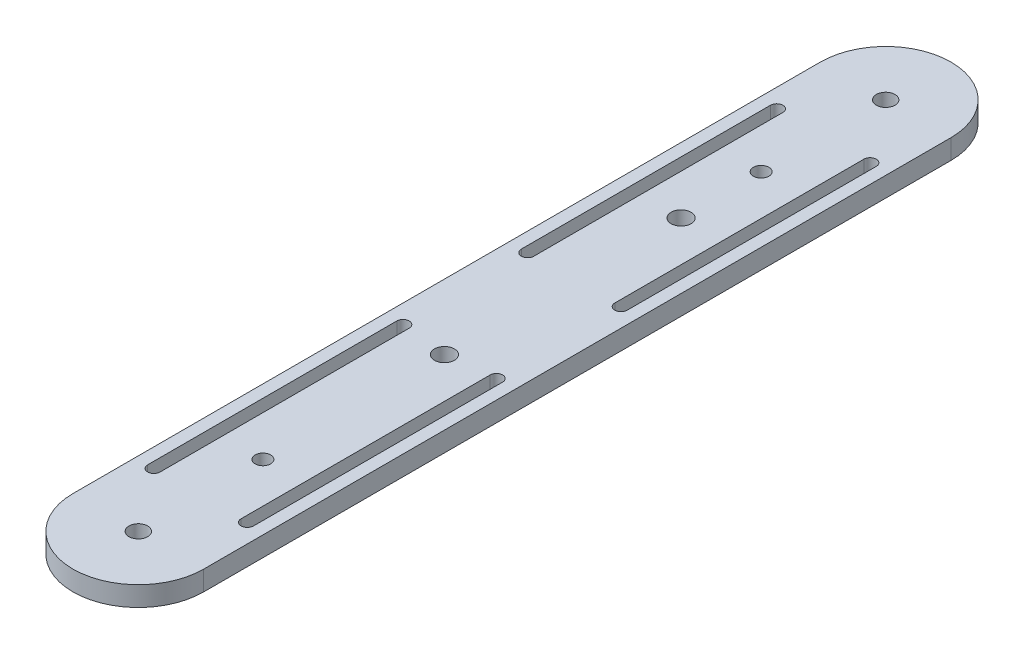
ISO-10303-21;
HEADER;
FILE_DESCRIPTION(('STEP AP214'),'2;1');
FILE_NAME('part.step','',(''),(''),'','','');
FILE_SCHEMA(('AUTOMOTIVE_DESIGN { 1 0 10303 214 1 1 1 1 }'));
ENDSEC;
DATA;
#1=APPLICATION_CONTEXT('core data for automotive mechanical design processes');
#2=APPLICATION_PROTOCOL_DEFINITION('international standard','automotive_design',2000,#1);
#3=PRODUCT_CONTEXT('',#1,'mechanical');
#4=PRODUCT('Part','Part','',(#3));
#5=PRODUCT_RELATED_PRODUCT_CATEGORY('part','',(#4));
#6=PRODUCT_DEFINITION_FORMATION('','',#4);
#7=PRODUCT_DEFINITION_CONTEXT('part definition',#1,'design');
#8=PRODUCT_DEFINITION('design','',#6,#7);
#9=PRODUCT_DEFINITION_SHAPE('','',#8);
#10=(LENGTH_UNIT() NAMED_UNIT(*) SI_UNIT(.MILLI.,.METRE.));
#11=(NAMED_UNIT(*) PLANE_ANGLE_UNIT() SI_UNIT($,.RADIAN.));
#12=(NAMED_UNIT(*) SI_UNIT($,.STERADIAN.) SOLID_ANGLE_UNIT());
#13=UNCERTAINTY_MEASURE_WITH_UNIT(LENGTH_MEASURE(1.E-05),#10,'distance_accuracy_value','');
#14=(GEOMETRIC_REPRESENTATION_CONTEXT(3) GLOBAL_UNCERTAINTY_ASSIGNED_CONTEXT((#13)) GLOBAL_UNIT_ASSIGNED_CONTEXT((#10,
#11,#12)) REPRESENTATION_CONTEXT('',''));
#15=CARTESIAN_POINT('',(0.,0.,0.));
#16=DIRECTION('',(0.,0.,1.));
#17=DIRECTION('',(1.,0.,0.));
#18=AXIS2_PLACEMENT_3D('',#15,#16,#17);
#19=CARTESIAN_POINT('',(0.,3.175,0.));
#20=DIRECTION('',(0.,1.,0.));
#21=DIRECTION('',(0.,0.,1.));
#22=AXIS2_PLACEMENT_3D('',#19,#20,#21);
#23=PLANE('',#22);
#24=CARTESIAN_POINT('',(0.,3.175,70.85));
#25=DIRECTION('',(0.,1.,0.));
#26=DIRECTION('',(0.,0.,1.));
#27=AXIS2_PLACEMENT_3D('',#24,#25,#26);
#28=CIRCLE('',#27,1.6);
#29=CARTESIAN_POINT('',(0.,3.175,72.45));
#30=VERTEX_POINT('',#29);
#31=EDGE_CURVE('E229',#30,#30,#28,.T.);
#32=ORIENTED_EDGE('',*,*,#31,.F.);
#33=EDGE_LOOP('',(#32));
#34=FACE_BOUND('',#33,.T.);
#35=CARTESIAN_POINT('',(0.,3.175,32.85));
#36=DIRECTION('',(0.,1.,0.));
#37=DIRECTION('',(0.,0.,1.));
#38=AXIS2_PLACEMENT_3D('',#35,#36,#37);
#39=CIRCLE('',#38,1.6);
#40=CARTESIAN_POINT('',(0.,3.175,34.45));
#41=VERTEX_POINT('',#40);
#42=EDGE_CURVE('E482',#41,#41,#39,.T.);
#43=ORIENTED_EDGE('',*,*,#42,.F.);
#44=EDGE_LOOP('',(#43));
#45=FACE_BOUND('',#44,.T.);
#46=CARTESIAN_POINT('',(-7.50000000000002,3.175,70.));
#47=DIRECTION('',(0.,1.,0.));
#48=DIRECTION('',(0.,0.,1.));
#49=AXIS2_PLACEMENT_3D('',#46,#47,#48);
#50=CIRCLE('',#49,0.999999999999999);
#51=CARTESIAN_POINT('',(-6.5,3.175,70.));
#52=VERTEX_POINT('',#51);
#53=CARTESIAN_POINT('',(-8.5,3.175,70.));
#54=VERTEX_POINT('',#53);
#55=EDGE_CURVE('E293',#52,#54,#50,.T.);
#56=ORIENTED_EDGE('',*,*,#55,.F.);
#57=DIRECTION('',(0.,0.,-1.));
#58=VECTOR('',#57,1.);
#59=CARTESIAN_POINT('',(-6.5,3.175,0.));
#60=LINE('',#59,#58);
#61=CARTESIAN_POINT('',(-6.5,3.175,110.));
#62=VERTEX_POINT('',#61);
#63=EDGE_CURVE('E287',#62,#52,#60,.T.);
#64=ORIENTED_EDGE('',*,*,#63,.F.);
#65=CARTESIAN_POINT('',(-7.50000000000013,3.175,110.));
#66=DIRECTION('',(0.,1.,0.));
#67=DIRECTION('',(0.,0.,1.));
#68=AXIS2_PLACEMENT_3D('',#65,#66,#67);
#69=CIRCLE('',#68,0.999999999999999);
#70=CARTESIAN_POINT('',(-8.50000000000013,3.175,110.));
#71=VERTEX_POINT('',#70);
#72=EDGE_CURVE('E289',#71,#62,#69,.T.);
#73=ORIENTED_EDGE('',*,*,#72,.F.);
#74=DIRECTION('',(0.,0.,1.));
#75=VECTOR('',#74,1.);
#76=CARTESIAN_POINT('',(-8.5,3.175,0.));
#77=LINE('',#76,#75);
#78=EDGE_CURVE('E291',#54,#71,#77,.T.);
#79=ORIENTED_EDGE('',*,*,#78,.F.);
#80=EDGE_LOOP('',(#56,#64,#73,#79));
#81=FACE_BOUND('',#80,.T.);
#82=CARTESIAN_POINT('',(7.49999999999986,3.175,110.));
#83=DIRECTION('',(0.,1.,0.));
#84=DIRECTION('',(0.,0.,1.));
#85=AXIS2_PLACEMENT_3D('',#82,#83,#84);
#86=CIRCLE('',#85,0.999999999999999);
#87=CARTESIAN_POINT('',(6.5,3.175,110.));
#88=VERTEX_POINT('',#87);
#89=CARTESIAN_POINT('',(8.5,3.175,110.));
#90=VERTEX_POINT('',#89);
#91=EDGE_CURVE('E285',#88,#90,#86,.T.);
#92=ORIENTED_EDGE('',*,*,#91,.F.);
#93=DIRECTION('',(0.,0.,1.));
#94=VECTOR('',#93,1.);
#95=CARTESIAN_POINT('',(6.5,3.175,0.));
#96=LINE('',#95,#94);
#97=CARTESIAN_POINT('',(6.5,3.175,70.));
#98=VERTEX_POINT('',#97);
#99=EDGE_CURVE('E279',#98,#88,#96,.T.);
#100=ORIENTED_EDGE('',*,*,#99,.F.);
#101=CARTESIAN_POINT('',(7.49999999999997,3.175,70.));
#102=DIRECTION('',(0.,1.,0.));
#103=DIRECTION('',(0.,0.,1.));
#104=AXIS2_PLACEMENT_3D('',#101,#102,#103);
#105=CIRCLE('',#104,0.999999999999999);
#106=CARTESIAN_POINT('',(8.5,3.175,70.));
#107=VERTEX_POINT('',#106);
#108=EDGE_CURVE('E281',#107,#98,#105,.T.);
#109=ORIENTED_EDGE('',*,*,#108,.F.);
#110=DIRECTION('',(0.,0.,-1.));
#111=VECTOR('',#110,1.);
#112=CARTESIAN_POINT('',(8.5,3.175,0.));
#113=LINE('',#112,#111);
#114=EDGE_CURVE('E283',#90,#107,#113,.T.);
#115=ORIENTED_EDGE('',*,*,#114,.F.);
#116=EDGE_LOOP('',(#92,#100,#109,#115));
#117=FACE_BOUND('',#116,.T.);
#118=CARTESIAN_POINT('',(7.5,3.175,50.));
#119=DIRECTION('',(0.,1.,0.));
#120=DIRECTION('',(0.,0.,1.));
#121=AXIS2_PLACEMENT_3D('',#118,#119,#120);
#122=CIRCLE('',#121,0.999999999999999);
#123=CARTESIAN_POINT('',(6.5,3.175,50.));
#124=VERTEX_POINT('',#123);
#125=CARTESIAN_POINT('',(8.5,3.175,50.));
#126=VERTEX_POINT('',#125);
#127=EDGE_CURVE('E277',#124,#126,#122,.T.);
#128=ORIENTED_EDGE('',*,*,#127,.F.);
#129=DIRECTION('',(0.,0.,1.));
#130=VECTOR('',#129,1.);
#131=CARTESIAN_POINT('',(6.5,3.175,0.));
#132=LINE('',#131,#130);
#133=CARTESIAN_POINT('',(6.5,3.175,9.99999999999999));
#134=VERTEX_POINT('',#133);
#135=EDGE_CURVE('E272',#134,#124,#132,.T.);
#136=ORIENTED_EDGE('',*,*,#135,.F.);
#137=CARTESIAN_POINT('',(7.5,3.175,10.));
#138=DIRECTION('',(0.,1.,0.));
#139=DIRECTION('',(0.,0.,1.));
#140=AXIS2_PLACEMENT_3D('',#137,#138,#139);
#141=CIRCLE('',#140,0.999999999999999);
#142=CARTESIAN_POINT('',(8.49999999999999,3.175,10.));
#143=VERTEX_POINT('',#142);
#144=EDGE_CURVE('E179',#143,#134,#141,.T.);
#145=ORIENTED_EDGE('',*,*,#144,.F.);
#146=DIRECTION('',(0.,0.,-1.));
#147=VECTOR('',#146,1.);
#148=CARTESIAN_POINT('',(8.5,3.175,0.));
#149=LINE('',#148,#147);
#150=EDGE_CURVE('E275',#126,#143,#149,.T.);
#151=ORIENTED_EDGE('',*,*,#150,.F.);
#152=EDGE_LOOP('',(#128,#136,#145,#151));
#153=FACE_BOUND('',#152,.T.);
#154=CARTESIAN_POINT('',(-7.5,3.175,50.));
#155=DIRECTION('',(0.,1.,0.));
#156=DIRECTION('',(0.,0.,1.));
#157=AXIS2_PLACEMENT_3D('',#154,#155,#156);
#158=CIRCLE('',#157,0.999999999999999);
#159=CARTESIAN_POINT('',(-8.5,3.175,50.));
#160=VERTEX_POINT('',#159);
#161=CARTESIAN_POINT('',(-6.5,3.175,50.));
#162=VERTEX_POINT('',#161);
#163=EDGE_CURVE('E270',#160,#162,#158,.T.);
#164=ORIENTED_EDGE('',*,*,#163,.F.);
#165=DIRECTION('',(0.,0.,1.));
#166=VECTOR('',#165,1.);
#167=CARTESIAN_POINT('',(-8.5,3.175,0.));
#168=LINE('',#167,#166);
#169=CARTESIAN_POINT('',(-8.5,3.175,10.));
#170=VERTEX_POINT('',#169);
#171=EDGE_CURVE('E257',#170,#160,#168,.T.);
#172=ORIENTED_EDGE('',*,*,#171,.F.);
#173=CARTESIAN_POINT('',(-7.5,3.175,10.));
#174=DIRECTION('',(0.,1.,0.));
#175=DIRECTION('',(0.,0.,1.));
#176=AXIS2_PLACEMENT_3D('',#173,#174,#175);
#177=CIRCLE('',#176,0.999999999999999);
#178=CARTESIAN_POINT('',(-6.5,3.175,9.99999999999999));
#179=VERTEX_POINT('',#178);
#180=EDGE_CURVE('E265',#179,#170,#177,.T.);
#181=ORIENTED_EDGE('',*,*,#180,.F.);
#182=DIRECTION('',(0.,0.,-1.));
#183=VECTOR('',#182,1.);
#184=CARTESIAN_POINT('',(-6.5,3.175,0.));
#185=LINE('',#184,#183);
#186=EDGE_CURVE('E268',#162,#179,#185,.T.);
#187=ORIENTED_EDGE('',*,*,#186,.F.);
#188=EDGE_LOOP('',(#164,#172,#181,#187));
#189=FACE_BOUND('',#188,.T.);
#190=CARTESIAN_POINT('',(0.,3.175,100.));
#191=DIRECTION('',(0.,1.,0.));
#192=DIRECTION('',(0.,0.,1.));
#193=AXIS2_PLACEMENT_3D('',#190,#191,#192);
#194=CIRCLE('',#193,1.25);
#195=CARTESIAN_POINT('',(0.,3.175,101.25));
#196=VERTEX_POINT('',#195);
#197=EDGE_CURVE('E298',#196,#196,#194,.T.);
#198=ORIENTED_EDGE('',*,*,#197,.F.);
#199=EDGE_LOOP('',(#198));
#200=FACE_BOUND('',#199,.T.);
#201=CARTESIAN_POINT('',(-1.43479954023023E-10,3.175,20.0000000000062));
#202=DIRECTION('',(0.,-1.,0.));
#203=DIRECTION('',(0.,0.,-1.));
#204=AXIS2_PLACEMENT_3D('',#201,#202,#203);
#205=CIRCLE('',#204,1.25);
#206=CARTESIAN_POINT('',(-1.43479954023023E-10,3.175,18.7500000000062));
#207=VERTEX_POINT('',#206);
#208=EDGE_CURVE('E301',#207,#207,#205,.T.);
#209=ORIENTED_EDGE('',*,*,#208,.T.);
#210=EDGE_LOOP('',(#209));
#211=FACE_BOUND('',#210,.T.);
#212=CARTESIAN_POINT('',(0.,3.175,0.));
#213=DIRECTION('',(0.,1.,0.));
#214=DIRECTION('',(0.,0.,1.));
#215=AXIS2_PLACEMENT_3D('',#212,#213,#214);
#216=CIRCLE('',#215,1.5);
#217=CARTESIAN_POINT('',(0.,3.175,1.5));
#218=VERTEX_POINT('',#217);
#219=EDGE_CURVE('E311',#218,#218,#216,.T.);
#220=ORIENTED_EDGE('',*,*,#219,.F.);
#221=EDGE_LOOP('',(#220));
#222=FACE_BOUND('',#221,.T.);
#223=CARTESIAN_POINT('',(0.,3.175,0.));
#224=DIRECTION('',(0.,1.,0.));
#225=DIRECTION('',(0.,0.,1.));
#226=AXIS2_PLACEMENT_3D('',#223,#224,#225);
#227=CIRCLE('',#226,10.5);
#228=CARTESIAN_POINT('',(10.5,3.175,0.));
#229=VERTEX_POINT('',#228);
#230=CARTESIAN_POINT('',(-10.5,3.175,0.));
#231=VERTEX_POINT('',#230);
#232=EDGE_CURVE('E317',#229,#231,#227,.T.);
#233=ORIENTED_EDGE('',*,*,#232,.T.);
#234=DIRECTION('',(0.,0.,1.));
#235=VECTOR('',#234,1.);
#236=CARTESIAN_POINT('',(-10.5,3.175,0.));
#237=LINE('',#236,#235);
#238=CARTESIAN_POINT('',(-10.5,3.175,120.));
#239=VERTEX_POINT('',#238);
#240=EDGE_CURVE('E320',#231,#239,#237,.T.);
#241=ORIENTED_EDGE('',*,*,#240,.T.);
#242=CARTESIAN_POINT('',(0.,3.175,120.));
#243=DIRECTION('',(0.,1.,0.));
#244=DIRECTION('',(0.,0.,1.));
#245=AXIS2_PLACEMENT_3D('',#242,#243,#244);
#246=CIRCLE('',#245,10.5);
#247=CARTESIAN_POINT('',(10.5,3.175,120.));
#248=VERTEX_POINT('',#247);
#249=EDGE_CURVE('E323',#239,#248,#246,.T.);
#250=ORIENTED_EDGE('',*,*,#249,.T.);
#251=DIRECTION('',(0.,0.,-1.));
#252=VECTOR('',#251,1.);
#253=CARTESIAN_POINT('',(10.5,3.175,0.));
#254=LINE('',#253,#252);
#255=EDGE_CURVE('E325',#248,#229,#254,.T.);
#256=ORIENTED_EDGE('',*,*,#255,.T.);
#257=EDGE_LOOP('',(#233,#241,#250,#256));
#258=FACE_BOUND('',#257,.T.);
#259=CARTESIAN_POINT('',(0.,3.175,120.));
#260=DIRECTION('',(0.,1.,0.));
#261=DIRECTION('',(0.,0.,1.));
#262=AXIS2_PLACEMENT_3D('',#259,#260,#261);
#263=CIRCLE('',#262,1.5);
#264=CARTESIAN_POINT('',(0.,3.175,121.5));
#265=VERTEX_POINT('',#264);
#266=EDGE_CURVE('E304',#265,#265,#263,.T.);
#267=ORIENTED_EDGE('',*,*,#266,.F.);
#268=EDGE_LOOP('',(#267));
#269=FACE_BOUND('',#268,.T.);
#270=ADVANCED_FACE('F33',(#34,#45,#81,#117,#153,#189,#200,#211,#222,#258,#269),#23,.T.);
#271=CARTESIAN_POINT('',(0.,0.,0.));
#272=DIRECTION('',(0.,1.,0.));
#273=DIRECTION('',(0.,0.,1.));
#274=AXIS2_PLACEMENT_3D('',#271,#272,#273);
#275=PLANE('',#274);
#276=CARTESIAN_POINT('',(0.,0.,70.85));
#277=DIRECTION('',(0.,-1.,0.));
#278=DIRECTION('',(0.,0.,-1.));
#279=AXIS2_PLACEMENT_3D('',#276,#277,#278);
#280=CIRCLE('',#279,1.6);
#281=CARTESIAN_POINT('',(0.,0.,69.25));
#282=VERTEX_POINT('',#281);
#283=EDGE_CURVE('E481',#282,#282,#280,.T.);
#284=ORIENTED_EDGE('',*,*,#283,.F.);
#285=EDGE_LOOP('',(#284));
#286=FACE_BOUND('',#285,.T.);
#287=CARTESIAN_POINT('',(0.,0.,32.85));
#288=DIRECTION('',(0.,-1.,0.));
#289=DIRECTION('',(0.,0.,-1.));
#290=AXIS2_PLACEMENT_3D('',#287,#288,#289);
#291=CIRCLE('',#290,1.6);
#292=CARTESIAN_POINT('',(0.,0.,31.25));
#293=VERTEX_POINT('',#292);
#294=EDGE_CURVE('E483',#293,#293,#291,.T.);
#295=ORIENTED_EDGE('',*,*,#294,.F.);
#296=EDGE_LOOP('',(#295));
#297=FACE_BOUND('',#296,.T.);
#298=DIRECTION('',(0.,0.,1.));
#299=VECTOR('',#298,1.);
#300=CARTESIAN_POINT('',(-6.5,0.,70.));
#301=LINE('',#300,#299);
#302=CARTESIAN_POINT('',(-6.5,0.,70.));
#303=VERTEX_POINT('',#302);
#304=CARTESIAN_POINT('',(-6.5,0.,110.));
#305=VERTEX_POINT('',#304);
#306=EDGE_CURVE('E228',#303,#305,#301,.T.);
#307=ORIENTED_EDGE('',*,*,#306,.F.);
#308=CARTESIAN_POINT('',(-7.50000000000002,0.,70.));
#309=DIRECTION('',(0.,-1.,0.));
#310=DIRECTION('',(0.,0.,1.));
#311=AXIS2_PLACEMENT_3D('',#308,#309,#310);
#312=CIRCLE('',#311,0.999999999999999);
#313=CARTESIAN_POINT('',(-8.5,0.,70.));
#314=VERTEX_POINT('',#313);
#315=EDGE_CURVE('E226',#314,#303,#312,.T.);
#316=ORIENTED_EDGE('',*,*,#315,.F.);
#317=DIRECTION('',(0.,0.,-1.));
#318=VECTOR('',#317,1.);
#319=CARTESIAN_POINT('',(-8.5,0.,110.));
#320=LINE('',#319,#318);
#321=CARTESIAN_POINT('',(-8.50000000000013,0.,110.));
#322=VERTEX_POINT('',#321);
#323=EDGE_CURVE('E234',#322,#314,#320,.T.);
#324=ORIENTED_EDGE('',*,*,#323,.F.);
#325=CARTESIAN_POINT('',(-7.50000000000013,0.,110.));
#326=DIRECTION('',(0.,-1.,0.));
#327=DIRECTION('',(0.,0.,1.));
#328=AXIS2_PLACEMENT_3D('',#325,#326,#327);
#329=CIRCLE('',#328,0.999999999999999);
#330=EDGE_CURVE('E231',#305,#322,#329,.T.);
#331=ORIENTED_EDGE('',*,*,#330,.F.);
#332=EDGE_LOOP('',(#307,#316,#324,#331));
#333=FACE_BOUND('',#332,.T.);
#334=DIRECTION('',(0.,0.,-1.));
#335=VECTOR('',#334,1.);
#336=CARTESIAN_POINT('',(6.5,0.,70.));
#337=LINE('',#336,#335);
#338=CARTESIAN_POINT('',(6.5,0.,110.));
#339=VERTEX_POINT('',#338);
#340=CARTESIAN_POINT('',(6.49999999999997,0.,70.));
#341=VERTEX_POINT('',#340);
#342=EDGE_CURVE('E209',#339,#341,#337,.T.);
#343=ORIENTED_EDGE('',*,*,#342,.F.);
#344=CARTESIAN_POINT('',(7.49999999999986,0.,110.));
#345=DIRECTION('',(0.,-1.,0.));
#346=DIRECTION('',(0.,0.,-1.));
#347=AXIS2_PLACEMENT_3D('',#344,#345,#346);
#348=CIRCLE('',#347,0.999999999999999);
#349=CARTESIAN_POINT('',(8.5,0.,110.));
#350=VERTEX_POINT('',#349);
#351=EDGE_CURVE('E207',#350,#339,#348,.T.);
#352=ORIENTED_EDGE('',*,*,#351,.F.);
#353=DIRECTION('',(0.,0.,1.));
#354=VECTOR('',#353,1.);
#355=CARTESIAN_POINT('',(8.5,0.,110.));
#356=LINE('',#355,#354);
#357=CARTESIAN_POINT('',(8.5,0.,70.));
#358=VERTEX_POINT('',#357);
#359=EDGE_CURVE('E215',#358,#350,#356,.T.);
#360=ORIENTED_EDGE('',*,*,#359,.F.);
#361=CARTESIAN_POINT('',(7.49999999999997,0.,70.));
#362=DIRECTION('',(0.,-1.,0.));
#363=DIRECTION('',(0.,0.,-1.));
#364=AXIS2_PLACEMENT_3D('',#361,#362,#363);
#365=CIRCLE('',#364,0.999999999999999);
#366=EDGE_CURVE('E212',#341,#358,#365,.T.);
#367=ORIENTED_EDGE('',*,*,#366,.F.);
#368=EDGE_LOOP('',(#343,#352,#360,#367));
#369=FACE_BOUND('',#368,.T.);
#370=DIRECTION('',(0.,0.,-1.));
#371=VECTOR('',#370,1.);
#372=CARTESIAN_POINT('',(6.5,0.,50.));
#373=LINE('',#372,#371);
#374=CARTESIAN_POINT('',(6.5,0.,50.));
#375=VERTEX_POINT('',#374);
#376=CARTESIAN_POINT('',(6.5,0.,9.99999999999999));
#377=VERTEX_POINT('',#376);
#378=EDGE_CURVE('E187',#375,#377,#373,.T.);
#379=ORIENTED_EDGE('',*,*,#378,.F.);
#380=CARTESIAN_POINT('',(7.5,0.,50.));
#381=DIRECTION('',(0.,-1.,0.));
#382=DIRECTION('',(0.,0.,1.));
#383=AXIS2_PLACEMENT_3D('',#380,#381,#382);
#384=CIRCLE('',#383,0.999999999999999);
#385=CARTESIAN_POINT('',(8.5,0.,50.));
#386=VERTEX_POINT('',#385);
#387=EDGE_CURVE('E192',#386,#375,#384,.T.);
#388=ORIENTED_EDGE('',*,*,#387,.F.);
#389=DIRECTION('',(0.,0.,1.));
#390=VECTOR('',#389,1.);
#391=CARTESIAN_POINT('',(8.5,0.,10.));
#392=LINE('',#391,#390);
#393=CARTESIAN_POINT('',(8.49999999999999,0.,10.));
#394=VERTEX_POINT('',#393);
#395=EDGE_CURVE('E197',#394,#386,#392,.T.);
#396=ORIENTED_EDGE('',*,*,#395,.F.);
#397=CARTESIAN_POINT('',(7.5,0.,10.));
#398=DIRECTION('',(0.,-1.,0.));
#399=DIRECTION('',(0.,0.,1.));
#400=AXIS2_PLACEMENT_3D('',#397,#398,#399);
#401=CIRCLE('',#400,0.999999999999999);
#402=EDGE_CURVE('E176',#377,#394,#401,.T.);
#403=ORIENTED_EDGE('',*,*,#402,.F.);
#404=EDGE_LOOP('',(#379,#388,#396,#403));
#405=FACE_BOUND('',#404,.T.);
#406=DIRECTION('',(0.,0.,-1.));
#407=VECTOR('',#406,1.);
#408=CARTESIAN_POINT('',(-8.5,0.,10.));
#409=LINE('',#408,#407);
#410=CARTESIAN_POINT('',(-8.5,0.,50.));
#411=VERTEX_POINT('',#410);
#412=CARTESIAN_POINT('',(-8.5,0.,10.));
#413=VERTEX_POINT('',#412);
#414=EDGE_CURVE('E245',#411,#413,#409,.T.);
#415=ORIENTED_EDGE('',*,*,#414,.F.);
#416=CARTESIAN_POINT('',(-7.5,0.,50.));
#417=DIRECTION('',(0.,-1.,0.));
#418=DIRECTION('',(0.,0.,-1.));
#419=AXIS2_PLACEMENT_3D('',#416,#417,#418);
#420=CIRCLE('',#419,0.999999999999999);
#421=CARTESIAN_POINT('',(-6.5,0.,50.));
#422=VERTEX_POINT('',#421);
#423=EDGE_CURVE('E204',#422,#411,#420,.T.);
#424=ORIENTED_EDGE('',*,*,#423,.F.);
#425=DIRECTION('',(0.,0.,1.));
#426=VECTOR('',#425,1.);
#427=CARTESIAN_POINT('',(-6.5,0.,50.));
#428=LINE('',#427,#426);
#429=CARTESIAN_POINT('',(-6.5,0.,9.99999999999999));
#430=VERTEX_POINT('',#429);
#431=EDGE_CURVE('E251',#430,#422,#428,.T.);
#432=ORIENTED_EDGE('',*,*,#431,.F.);
#433=CARTESIAN_POINT('',(-7.5,0.,10.));
#434=DIRECTION('',(0.,-1.,0.));
#435=DIRECTION('',(0.,0.,-1.));
#436=AXIS2_PLACEMENT_3D('',#433,#434,#435);
#437=CIRCLE('',#436,0.999999999999999);
#438=EDGE_CURVE('E248',#413,#430,#437,.T.);
#439=ORIENTED_EDGE('',*,*,#438,.F.);
#440=EDGE_LOOP('',(#415,#424,#432,#439));
#441=FACE_BOUND('',#440,.T.);
#442=CARTESIAN_POINT('',(0.,0.,100.));
#443=DIRECTION('',(0.,1.,0.));
#444=DIRECTION('',(0.,0.,1.));
#445=AXIS2_PLACEMENT_3D('',#442,#443,#444);
#446=CIRCLE('',#445,1.25);
#447=CARTESIAN_POINT('',(0.,0.,101.25));
#448=VERTEX_POINT('',#447);
#449=EDGE_CURVE('E295',#448,#448,#446,.T.);
#450=ORIENTED_EDGE('',*,*,#449,.T.);
#451=EDGE_LOOP('',(#450));
#452=FACE_BOUND('',#451,.T.);
#453=CARTESIAN_POINT('',(-1.43479954023023E-10,0.,20.0000000000062));
#454=DIRECTION('',(0.,1.,0.));
#455=DIRECTION('',(0.,0.,1.));
#456=AXIS2_PLACEMENT_3D('',#453,#454,#455);
#457=CIRCLE('',#456,1.25);
#458=CARTESIAN_POINT('',(-1.43479954023023E-10,0.,21.2500000000062));
#459=VERTEX_POINT('',#458);
#460=EDGE_CURVE('E37',#459,#459,#457,.T.);
#461=ORIENTED_EDGE('',*,*,#460,.T.);
#462=EDGE_LOOP('',(#461));
#463=FACE_BOUND('',#462,.T.);
#464=CARTESIAN_POINT('',(0.,0.,0.));
#465=DIRECTION('',(0.,1.,0.));
#466=DIRECTION('',(0.,0.,1.));
#467=AXIS2_PLACEMENT_3D('',#464,#465,#466);
#468=CIRCLE('',#467,10.5);
#469=CARTESIAN_POINT('',(10.5,0.,0.));
#470=VERTEX_POINT('',#469);
#471=CARTESIAN_POINT('',(-10.5,0.,0.));
#472=VERTEX_POINT('',#471);
#473=EDGE_CURVE('E314',#470,#472,#468,.T.);
#474=ORIENTED_EDGE('',*,*,#473,.F.);
#475=DIRECTION('',(0.,0.,-1.));
#476=VECTOR('',#475,1.);
#477=CARTESIAN_POINT('',(10.5,0.,0.));
#478=LINE('',#477,#476);
#479=CARTESIAN_POINT('',(10.5,0.,120.));
#480=VERTEX_POINT('',#479);
#481=EDGE_CURVE('E321',#480,#470,#478,.T.);
#482=ORIENTED_EDGE('',*,*,#481,.F.);
#483=CARTESIAN_POINT('',(0.,0.,120.));
#484=DIRECTION('',(0.,1.,0.));
#485=DIRECTION('',(0.,0.,1.));
#486=AXIS2_PLACEMENT_3D('',#483,#484,#485);
#487=CIRCLE('',#486,10.5);
#488=CARTESIAN_POINT('',(-10.5,0.,120.));
#489=VERTEX_POINT('',#488);
#490=EDGE_CURVE('E332',#489,#480,#487,.T.);
#491=ORIENTED_EDGE('',*,*,#490,.F.);
#492=DIRECTION('',(0.,0.,1.));
#493=VECTOR('',#492,1.);
#494=CARTESIAN_POINT('',(-10.5,0.,0.));
#495=LINE('',#494,#493);
#496=EDGE_CURVE('E330',#472,#489,#495,.T.);
#497=ORIENTED_EDGE('',*,*,#496,.F.);
#498=EDGE_LOOP('',(#474,#482,#491,#497));
#499=FACE_BOUND('',#498,.T.);
#500=CARTESIAN_POINT('',(0.,0.,0.));
#501=DIRECTION('',(0.,1.,0.));
#502=DIRECTION('',(0.,0.,1.));
#503=AXIS2_PLACEMENT_3D('',#500,#501,#502);
#504=CIRCLE('',#503,1.5);
#505=CARTESIAN_POINT('',(0.,0.,1.5));
#506=VERTEX_POINT('',#505);
#507=EDGE_CURVE('E307',#506,#506,#504,.T.);
#508=ORIENTED_EDGE('',*,*,#507,.T.);
#509=EDGE_LOOP('',(#508));
#510=FACE_BOUND('',#509,.T.);
#511=CARTESIAN_POINT('',(0.,0.,120.));
#512=DIRECTION('',(0.,1.,0.));
#513=DIRECTION('',(0.,0.,1.));
#514=AXIS2_PLACEMENT_3D('',#511,#512,#513);
#515=CIRCLE('',#514,1.5);
#516=CARTESIAN_POINT('',(0.,0.,121.5));
#517=VERTEX_POINT('',#516);
#518=EDGE_CURVE('E308',#517,#517,#515,.T.);
#519=ORIENTED_EDGE('',*,*,#518,.T.);
#520=EDGE_LOOP('',(#519));
#521=FACE_BOUND('',#520,.T.);
#522=ADVANCED_FACE('F194',(#286,#297,#333,#369,#405,#441,#452,#463,#499,#510,#521),#275,.F.);
#523=CARTESIAN_POINT('',(0.,3.175,0.));
#524=DIRECTION('',(0.,-1.,0.));
#525=DIRECTION('',(0.,0.,-1.));
#526=AXIS2_PLACEMENT_3D('',#523,#524,#525);
#527=CYLINDRICAL_SURFACE('',#526,10.5);
#528=ORIENTED_EDGE('',*,*,#473,.T.);
#529=DIRECTION('',(0.,-1.,0.));
#530=VECTOR('',#529,1.);
#531=CARTESIAN_POINT('',(-10.5,3.175,0.));
#532=LINE('',#531,#530);
#533=EDGE_CURVE('E11',#231,#472,#532,.T.);
#534=ORIENTED_EDGE('',*,*,#533,.F.);
#535=ORIENTED_EDGE('',*,*,#232,.F.);
#536=DIRECTION('',(0.,-1.,0.));
#537=VECTOR('',#536,1.);
#538=CARTESIAN_POINT('',(10.5,3.175,0.));
#539=LINE('',#538,#537);
#540=EDGE_CURVE('E327',#229,#470,#539,.T.);
#541=ORIENTED_EDGE('',*,*,#540,.T.);
#542=EDGE_LOOP('',(#528,#534,#535,#541));
#543=FACE_BOUND('',#542,.T.);
#544=ADVANCED_FACE('F35',(#543),#527,.T.);
#545=CARTESIAN_POINT('',(-10.5,3.175,0.));
#546=DIRECTION('',(1.,0.,0.));
#547=DIRECTION('',(0.,0.,-1.));
#548=AXIS2_PLACEMENT_3D('',#545,#546,#547);
#549=PLANE('',#548);
#550=ORIENTED_EDGE('',*,*,#496,.T.);
#551=DIRECTION('',(0.,-1.,0.));
#552=VECTOR('',#551,1.);
#553=CARTESIAN_POINT('',(-10.5,3.175,120.));
#554=LINE('',#553,#552);
#555=EDGE_CURVE('E42',#239,#489,#554,.T.);
#556=ORIENTED_EDGE('',*,*,#555,.F.);
#557=ORIENTED_EDGE('',*,*,#240,.F.);
#558=ORIENTED_EDGE('',*,*,#533,.T.);
#559=EDGE_LOOP('',(#550,#556,#557,#558));
#560=FACE_BOUND('',#559,.T.);
#561=ADVANCED_FACE('F361',(#560),#549,.F.);
#562=CARTESIAN_POINT('',(0.,3.175,120.));
#563=DIRECTION('',(0.,-1.,0.));
#564=DIRECTION('',(0.,0.,-1.));
#565=AXIS2_PLACEMENT_3D('',#562,#563,#564);
#566=CYLINDRICAL_SURFACE('',#565,10.5);
#567=ORIENTED_EDGE('',*,*,#490,.T.);
#568=DIRECTION('',(0.,-1.,0.));
#569=VECTOR('',#568,1.);
#570=CARTESIAN_POINT('',(10.5,3.175,120.));
#571=LINE('',#570,#569);
#572=EDGE_CURVE('E337',#248,#480,#571,.T.);
#573=ORIENTED_EDGE('',*,*,#572,.F.);
#574=ORIENTED_EDGE('',*,*,#249,.F.);
#575=ORIENTED_EDGE('',*,*,#555,.T.);
#576=EDGE_LOOP('',(#567,#573,#574,#575));
#577=FACE_BOUND('',#576,.T.);
#578=ADVANCED_FACE('F345',(#577),#566,.T.);
#579=CARTESIAN_POINT('',(10.5,3.175,0.));
#580=DIRECTION('',(-1.,0.,0.));
#581=DIRECTION('',(0.,0.,1.));
#582=AXIS2_PLACEMENT_3D('',#579,#580,#581);
#583=PLANE('',#582);
#584=ORIENTED_EDGE('',*,*,#481,.T.);
#585=ORIENTED_EDGE('',*,*,#540,.F.);
#586=ORIENTED_EDGE('',*,*,#255,.F.);
#587=ORIENTED_EDGE('',*,*,#572,.T.);
#588=EDGE_LOOP('',(#584,#585,#586,#587));
#589=FACE_BOUND('',#588,.T.);
#590=ADVANCED_FACE('F354',(#589),#583,.F.);
#591=CARTESIAN_POINT('',(0.,3.175,0.));
#592=DIRECTION('',(0.,-1.,0.));
#593=DIRECTION('',(0.,0.,-1.));
#594=AXIS2_PLACEMENT_3D('',#591,#592,#593);
#595=CYLINDRICAL_SURFACE('',#594,1.5);
#596=ORIENTED_EDGE('',*,*,#219,.T.);
#597=EDGE_LOOP('',(#596));
#598=FACE_BOUND('',#597,.T.);
#599=ORIENTED_EDGE('',*,*,#507,.F.);
#600=EDGE_LOOP('',(#599));
#601=FACE_BOUND('',#600,.T.);
#602=ADVANCED_FACE('F379',(#598,#601),#595,.F.);
#603=CARTESIAN_POINT('',(0.,3.175,120.));
#604=DIRECTION('',(0.,-1.,0.));
#605=DIRECTION('',(0.,0.,-1.));
#606=AXIS2_PLACEMENT_3D('',#603,#604,#605);
#607=CYLINDRICAL_SURFACE('',#606,1.5);
#608=ORIENTED_EDGE('',*,*,#266,.T.);
#609=EDGE_LOOP('',(#608));
#610=FACE_BOUND('',#609,.T.);
#611=ORIENTED_EDGE('',*,*,#518,.F.);
#612=EDGE_LOOP('',(#611));
#613=FACE_BOUND('',#612,.T.);
#614=ADVANCED_FACE('F386',(#610,#613),#607,.F.);
#615=CARTESIAN_POINT('',(-1.43479954023023E-10,3.175,20.0000000000062));
#616=DIRECTION('',(0.,-1.,0.));
#617=DIRECTION('',(0.,0.,-1.));
#618=AXIS2_PLACEMENT_3D('',#615,#616,#617);
#619=CYLINDRICAL_SURFACE('',#618,1.25);
#620=ORIENTED_EDGE('',*,*,#208,.F.);
#621=EDGE_LOOP('',(#620));
#622=FACE_BOUND('',#621,.T.);
#623=ORIENTED_EDGE('',*,*,#460,.F.);
#624=EDGE_LOOP('',(#623));
#625=FACE_BOUND('',#624,.T.);
#626=ADVANCED_FACE('F391',(#622,#625),#619,.F.);
#627=CARTESIAN_POINT('',(0.,0.,100.));
#628=DIRECTION('',(0.,1.,0.));
#629=DIRECTION('',(0.,0.,1.));
#630=AXIS2_PLACEMENT_3D('',#627,#628,#629);
#631=CYLINDRICAL_SURFACE('',#630,1.25);
#632=ORIENTED_EDGE('',*,*,#197,.T.);
#633=EDGE_LOOP('',(#632));
#634=FACE_BOUND('',#633,.T.);
#635=ORIENTED_EDGE('',*,*,#449,.F.);
#636=EDGE_LOOP('',(#635));
#637=FACE_BOUND('',#636,.T.);
#638=ADVANCED_FACE('F403',(#634,#637),#631,.F.);
#639=CARTESIAN_POINT('',(-7.5,40.,50.));
#640=DIRECTION('',(0.,-1.,0.));
#641=DIRECTION('',(0.,0.,-1.));
#642=AXIS2_PLACEMENT_3D('',#639,#640,#641);
#643=CYLINDRICAL_SURFACE('',#642,0.999999999999999);
#644=ORIENTED_EDGE('',*,*,#163,.T.);
#645=DIRECTION('',(0.,-1.,0.));
#646=VECTOR('',#645,1.);
#647=CARTESIAN_POINT('',(-6.5,40.,50.));
#648=LINE('',#647,#646);
#649=EDGE_CURVE('E255',#162,#422,#648,.T.);
#650=ORIENTED_EDGE('',*,*,#649,.T.);
#651=ORIENTED_EDGE('',*,*,#423,.T.);
#652=DIRECTION('',(0.,-1.,0.));
#653=VECTOR('',#652,1.);
#654=CARTESIAN_POINT('',(-8.5,40.,50.));
#655=LINE('',#654,#653);
#656=EDGE_CURVE('E254',#160,#411,#655,.T.);
#657=ORIENTED_EDGE('',*,*,#656,.F.);
#658=EDGE_LOOP('',(#644,#650,#651,#657));
#659=FACE_BOUND('',#658,.T.);
#660=ADVANCED_FACE('F409',(#659),#643,.F.);
#661=CARTESIAN_POINT('',(-6.5,40.,50.));
#662=DIRECTION('',(1.,0.,0.));
#663=DIRECTION('',(0.,0.,-1.));
#664=AXIS2_PLACEMENT_3D('',#661,#662,#663);
#665=PLANE('',#664);
#666=ORIENTED_EDGE('',*,*,#186,.T.);
#667=DIRECTION('',(0.,-1.,0.));
#668=VECTOR('',#667,1.);
#669=CARTESIAN_POINT('',(-6.5,40.,9.99999999999999));
#670=LINE('',#669,#668);
#671=EDGE_CURVE('E258',#179,#430,#670,.T.);
#672=ORIENTED_EDGE('',*,*,#671,.T.);
#673=ORIENTED_EDGE('',*,*,#431,.T.);
#674=ORIENTED_EDGE('',*,*,#649,.F.);
#675=EDGE_LOOP('',(#666,#672,#673,#674));
#676=FACE_BOUND('',#675,.T.);
#677=ADVANCED_FACE('F413',(#676),#665,.F.);
#678=CARTESIAN_POINT('',(-7.5,40.,10.));
#679=DIRECTION('',(0.,-1.,0.));
#680=DIRECTION('',(0.,0.,-1.));
#681=AXIS2_PLACEMENT_3D('',#678,#679,#680);
#682=CYLINDRICAL_SURFACE('',#681,0.999999999999999);
#683=ORIENTED_EDGE('',*,*,#180,.T.);
#684=DIRECTION('',(0.,-1.,0.));
#685=VECTOR('',#684,1.);
#686=CARTESIAN_POINT('',(-8.5,40.,10.));
#687=LINE('',#686,#685);
#688=EDGE_CURVE('E260',#170,#413,#687,.T.);
#689=ORIENTED_EDGE('',*,*,#688,.T.);
#690=ORIENTED_EDGE('',*,*,#438,.T.);
#691=ORIENTED_EDGE('',*,*,#671,.F.);
#692=EDGE_LOOP('',(#683,#689,#690,#691));
#693=FACE_BOUND('',#692,.T.);
#694=ADVANCED_FACE('F419',(#693),#682,.F.);
#695=CARTESIAN_POINT('',(-8.5,40.,10.));
#696=DIRECTION('',(-1.,0.,0.));
#697=DIRECTION('',(0.,0.,1.));
#698=AXIS2_PLACEMENT_3D('',#695,#696,#697);
#699=PLANE('',#698);
#700=ORIENTED_EDGE('',*,*,#171,.T.);
#701=ORIENTED_EDGE('',*,*,#656,.T.);
#702=ORIENTED_EDGE('',*,*,#414,.T.);
#703=ORIENTED_EDGE('',*,*,#688,.F.);
#704=EDGE_LOOP('',(#700,#701,#702,#703));
#705=FACE_BOUND('',#704,.T.);
#706=ADVANCED_FACE('F415',(#705),#699,.F.);
#707=CARTESIAN_POINT('',(7.5,40.,50.));
#708=DIRECTION('',(0.,-1.,0.));
#709=DIRECTION('',(0.,0.,-1.));
#710=AXIS2_PLACEMENT_3D('',#707,#708,#709);
#711=CYLINDRICAL_SURFACE('',#710,0.999999999999999);
#712=ORIENTED_EDGE('',*,*,#127,.T.);
#713=DIRECTION('',(0.,-1.,0.));
#714=VECTOR('',#713,1.);
#715=CARTESIAN_POINT('',(8.5,40.,50.));
#716=LINE('',#715,#714);
#717=EDGE_CURVE('E202',#126,#386,#716,.T.);
#718=ORIENTED_EDGE('',*,*,#717,.T.);
#719=ORIENTED_EDGE('',*,*,#387,.T.);
#720=DIRECTION('',(0.,-1.,0.));
#721=VECTOR('',#720,1.);
#722=CARTESIAN_POINT('',(6.5,40.,50.));
#723=LINE('',#722,#721);
#724=EDGE_CURVE('E183',#124,#375,#723,.T.);
#725=ORIENTED_EDGE('',*,*,#724,.F.);
#726=EDGE_LOOP('',(#712,#718,#719,#725));
#727=FACE_BOUND('',#726,.T.);
#728=ADVANCED_FACE('F418',(#727),#711,.F.);
#729=CARTESIAN_POINT('',(8.5,40.,10.));
#730=DIRECTION('',(1.,0.,0.));
#731=DIRECTION('',(0.,0.,-1.));
#732=AXIS2_PLACEMENT_3D('',#729,#730,#731);
#733=PLANE('',#732);
#734=ORIENTED_EDGE('',*,*,#150,.T.);
#735=DIRECTION('',(0.,-1.,0.));
#736=VECTOR('',#735,1.);
#737=CARTESIAN_POINT('',(8.49999999999999,40.,10.));
#738=LINE('',#737,#736);
#739=EDGE_CURVE('E182',#143,#394,#738,.T.);
#740=ORIENTED_EDGE('',*,*,#739,.T.);
#741=ORIENTED_EDGE('',*,*,#395,.T.);
#742=ORIENTED_EDGE('',*,*,#717,.F.);
#743=EDGE_LOOP('',(#734,#740,#741,#742));
#744=FACE_BOUND('',#743,.T.);
#745=ADVANCED_FACE('F460',(#744),#733,.F.);
#746=CARTESIAN_POINT('',(7.5,40.,10.));
#747=DIRECTION('',(0.,-1.,0.));
#748=DIRECTION('',(0.,0.,-1.));
#749=AXIS2_PLACEMENT_3D('',#746,#747,#748);
#750=CYLINDRICAL_SURFACE('',#749,0.999999999999999);
#751=ORIENTED_EDGE('',*,*,#144,.T.);
#752=DIRECTION('',(0.,-1.,0.));
#753=VECTOR('',#752,1.);
#754=CARTESIAN_POINT('',(6.5,40.,9.99999999999999));
#755=LINE('',#754,#753);
#756=EDGE_CURVE('E171',#134,#377,#755,.T.);
#757=ORIENTED_EDGE('',*,*,#756,.T.);
#758=ORIENTED_EDGE('',*,*,#402,.T.);
#759=ORIENTED_EDGE('',*,*,#739,.F.);
#760=EDGE_LOOP('',(#751,#757,#758,#759));
#761=FACE_BOUND('',#760,.T.);
#762=ADVANCED_FACE('F173',(#761),#750,.F.);
#763=CARTESIAN_POINT('',(6.5,40.,50.));
#764=DIRECTION('',(-1.,0.,0.));
#765=DIRECTION('',(0.,0.,1.));
#766=AXIS2_PLACEMENT_3D('',#763,#764,#765);
#767=PLANE('',#766);
#768=ORIENTED_EDGE('',*,*,#135,.T.);
#769=ORIENTED_EDGE('',*,*,#724,.T.);
#770=ORIENTED_EDGE('',*,*,#378,.T.);
#771=ORIENTED_EDGE('',*,*,#756,.F.);
#772=EDGE_LOOP('',(#768,#769,#770,#771));
#773=FACE_BOUND('',#772,.T.);
#774=ADVANCED_FACE('F188',(#773),#767,.F.);
#775=CARTESIAN_POINT('',(7.49999999999986,40.,110.));
#776=DIRECTION('',(0.,-1.,0.));
#777=DIRECTION('',(0.,0.,-1.));
#778=AXIS2_PLACEMENT_3D('',#775,#776,#777);
#779=CYLINDRICAL_SURFACE('',#778,0.999999999999999);
#780=ORIENTED_EDGE('',*,*,#91,.T.);
#781=DIRECTION('',(0.,-1.,0.));
#782=VECTOR('',#781,1.);
#783=CARTESIAN_POINT('',(8.5,40.,110.));
#784=LINE('',#783,#782);
#785=EDGE_CURVE('E219',#90,#350,#784,.T.);
#786=ORIENTED_EDGE('',*,*,#785,.T.);
#787=ORIENTED_EDGE('',*,*,#351,.T.);
#788=DIRECTION('',(0.,-1.,0.));
#789=VECTOR('',#788,1.);
#790=CARTESIAN_POINT('',(6.5,40.,110.));
#791=LINE('',#790,#789);
#792=EDGE_CURVE('E218',#88,#339,#791,.T.);
#793=ORIENTED_EDGE('',*,*,#792,.F.);
#794=EDGE_LOOP('',(#780,#786,#787,#793));
#795=FACE_BOUND('',#794,.T.);
#796=ADVANCED_FACE('F444',(#795),#779,.F.);
#797=CARTESIAN_POINT('',(8.5,40.,110.));
#798=DIRECTION('',(1.,0.,0.));
#799=DIRECTION('',(0.,0.,-1.));
#800=AXIS2_PLACEMENT_3D('',#797,#798,#799);
#801=PLANE('',#800);
#802=ORIENTED_EDGE('',*,*,#114,.T.);
#803=DIRECTION('',(0.,-1.,0.));
#804=VECTOR('',#803,1.);
#805=CARTESIAN_POINT('',(8.5,40.,70.));
#806=LINE('',#805,#804);
#807=EDGE_CURVE('E221',#107,#358,#806,.T.);
#808=ORIENTED_EDGE('',*,*,#807,.T.);
#809=ORIENTED_EDGE('',*,*,#359,.T.);
#810=ORIENTED_EDGE('',*,*,#785,.F.);
#811=EDGE_LOOP('',(#802,#808,#809,#810));
#812=FACE_BOUND('',#811,.T.);
#813=ADVANCED_FACE('F447',(#812),#801,.F.);
#814=CARTESIAN_POINT('',(7.49999999999997,40.,70.));
#815=DIRECTION('',(0.,-1.,0.));
#816=DIRECTION('',(0.,0.,-1.));
#817=AXIS2_PLACEMENT_3D('',#814,#815,#816);
#818=CYLINDRICAL_SURFACE('',#817,0.999999999999999);
#819=ORIENTED_EDGE('',*,*,#108,.T.);
#820=DIRECTION('',(0.,-1.,0.));
#821=VECTOR('',#820,1.);
#822=CARTESIAN_POINT('',(6.49999999999997,40.,70.));
#823=LINE('',#822,#821);
#824=EDGE_CURVE('E57',#98,#341,#823,.T.);
#825=ORIENTED_EDGE('',*,*,#824,.T.);
#826=ORIENTED_EDGE('',*,*,#366,.T.);
#827=ORIENTED_EDGE('',*,*,#807,.F.);
#828=EDGE_LOOP('',(#819,#825,#826,#827));
#829=FACE_BOUND('',#828,.T.);
#830=ADVANCED_FACE('F451',(#829),#818,.F.);
#831=CARTESIAN_POINT('',(6.5,40.,70.));
#832=DIRECTION('',(-1.,0.,0.));
#833=DIRECTION('',(0.,0.,1.));
#834=AXIS2_PLACEMENT_3D('',#831,#832,#833);
#835=PLANE('',#834);
#836=ORIENTED_EDGE('',*,*,#99,.T.);
#837=ORIENTED_EDGE('',*,*,#792,.T.);
#838=ORIENTED_EDGE('',*,*,#342,.T.);
#839=ORIENTED_EDGE('',*,*,#824,.F.);
#840=EDGE_LOOP('',(#836,#837,#838,#839));
#841=FACE_BOUND('',#840,.T.);
#842=ADVANCED_FACE('F431',(#841),#835,.F.);
#843=CARTESIAN_POINT('',(-7.50000000000002,40.,70.));
#844=DIRECTION('',(0.,-1.,0.));
#845=DIRECTION('',(0.,0.,-1.));
#846=AXIS2_PLACEMENT_3D('',#843,#844,#845);
#847=CYLINDRICAL_SURFACE('',#846,0.999999999999999);
#848=ORIENTED_EDGE('',*,*,#55,.T.);
#849=DIRECTION('',(0.,-1.,0.));
#850=VECTOR('',#849,1.);
#851=CARTESIAN_POINT('',(-8.5,40.,70.));
#852=LINE('',#851,#850);
#853=EDGE_CURVE('E210',#54,#314,#852,.T.);
#854=ORIENTED_EDGE('',*,*,#853,.T.);
#855=ORIENTED_EDGE('',*,*,#315,.T.);
#856=DIRECTION('',(0.,-1.,0.));
#857=VECTOR('',#856,1.);
#858=CARTESIAN_POINT('',(-6.5,40.,70.));
#859=LINE('',#858,#857);
#860=EDGE_CURVE('E237',#52,#303,#859,.T.);
#861=ORIENTED_EDGE('',*,*,#860,.F.);
#862=EDGE_LOOP('',(#848,#854,#855,#861));
#863=FACE_BOUND('',#862,.T.);
#864=ADVANCED_FACE('F427',(#863),#847,.F.);
#865=CARTESIAN_POINT('',(-8.5,40.,110.));
#866=DIRECTION('',(-1.,0.,0.));
#867=DIRECTION('',(0.,0.,1.));
#868=AXIS2_PLACEMENT_3D('',#865,#866,#867);
#869=PLANE('',#868);
#870=ORIENTED_EDGE('',*,*,#78,.T.);
#871=DIRECTION('',(0.,-1.,0.));
#872=VECTOR('',#871,1.);
#873=CARTESIAN_POINT('',(-8.50000000000013,40.,110.));
#874=LINE('',#873,#872);
#875=EDGE_CURVE('E239',#71,#322,#874,.T.);
#876=ORIENTED_EDGE('',*,*,#875,.T.);
#877=ORIENTED_EDGE('',*,*,#323,.T.);
#878=ORIENTED_EDGE('',*,*,#853,.F.);
#879=EDGE_LOOP('',(#870,#876,#877,#878));
#880=FACE_BOUND('',#879,.T.);
#881=ADVANCED_FACE('F430',(#880),#869,.F.);
#882=CARTESIAN_POINT('',(-7.50000000000013,40.,110.));
#883=DIRECTION('',(0.,-1.,0.));
#884=DIRECTION('',(0.,0.,-1.));
#885=AXIS2_PLACEMENT_3D('',#882,#883,#884);
#886=CYLINDRICAL_SURFACE('',#885,0.999999999999999);
#887=ORIENTED_EDGE('',*,*,#72,.T.);
#888=DIRECTION('',(0.,-1.,0.));
#889=VECTOR('',#888,1.);
#890=CARTESIAN_POINT('',(-6.5,40.,110.));
#891=LINE('',#890,#889);
#892=EDGE_CURVE('E49',#62,#305,#891,.T.);
#893=ORIENTED_EDGE('',*,*,#892,.T.);
#894=ORIENTED_EDGE('',*,*,#330,.T.);
#895=ORIENTED_EDGE('',*,*,#875,.F.);
#896=EDGE_LOOP('',(#887,#893,#894,#895));
#897=FACE_BOUND('',#896,.T.);
#898=ADVANCED_FACE('F437',(#897),#886,.F.);
#899=CARTESIAN_POINT('',(-6.5,40.,70.));
#900=DIRECTION('',(1.,0.,0.));
#901=DIRECTION('',(0.,0.,-1.));
#902=AXIS2_PLACEMENT_3D('',#899,#900,#901);
#903=PLANE('',#902);
#904=ORIENTED_EDGE('',*,*,#63,.T.);
#905=ORIENTED_EDGE('',*,*,#860,.T.);
#906=ORIENTED_EDGE('',*,*,#306,.T.);
#907=ORIENTED_EDGE('',*,*,#892,.F.);
#908=EDGE_LOOP('',(#904,#905,#906,#907));
#909=FACE_BOUND('',#908,.T.);
#910=ADVANCED_FACE('F433',(#909),#903,.F.);
#911=CARTESIAN_POINT('',(0.,10.,32.85));
#912=DIRECTION('',(0.,-1.,0.));
#913=DIRECTION('',(0.,0.,-1.));
#914=AXIS2_PLACEMENT_3D('',#911,#912,#913);
#915=CYLINDRICAL_SURFACE('',#914,1.6);
#916=ORIENTED_EDGE('',*,*,#42,.T.);
#917=EDGE_LOOP('',(#916));
#918=FACE_BOUND('',#917,.T.);
#919=ORIENTED_EDGE('',*,*,#294,.T.);
#920=EDGE_LOOP('',(#919));
#921=FACE_BOUND('',#920,.T.);
#922=ADVANCED_FACE('F436',(#918,#921),#915,.F.);
#923=CARTESIAN_POINT('',(0.,10.,70.85));
#924=DIRECTION('',(0.,-1.,0.));
#925=DIRECTION('',(0.,0.,-1.));
#926=AXIS2_PLACEMENT_3D('',#923,#924,#925);
#927=CYLINDRICAL_SURFACE('',#926,1.6);
#928=ORIENTED_EDGE('',*,*,#31,.T.);
#929=EDGE_LOOP('',(#928));
#930=FACE_BOUND('',#929,.T.);
#931=ORIENTED_EDGE('',*,*,#283,.T.);
#932=EDGE_LOOP('',(#931));
#933=FACE_BOUND('',#932,.T.);
#934=ADVANCED_FACE('F471',(#930,#933),#927,.F.);
#935=CLOSED_SHELL('',(#270,#522,#544,#561,#578,#590,#602,#614,#626,#638,#660,#677,#694,#706,
#728,#745,#762,#774,#796,#813,#830,#842,#864,#881,#898,#910,#922,#934));
#936=MANIFOLD_SOLID_BREP('B2',#935);
#937=ADVANCED_BREP_SHAPE_REPRESENTATION('',(#18,#936),#14);
#938=SHAPE_DEFINITION_REPRESENTATION(#9,#937);
ENDSEC;
END-ISO-10303-21;
